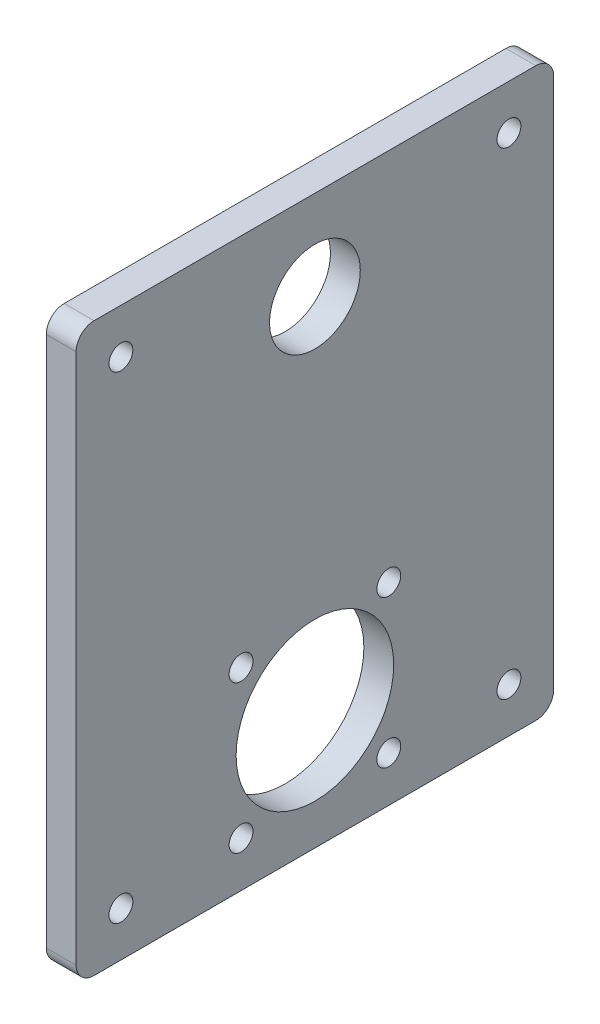
ISO-10303-21;
HEADER;
FILE_DESCRIPTION(('STEP AP214'),'2;1');
FILE_NAME('part.step','',(''),(''),'','','');
FILE_SCHEMA(('AUTOMOTIVE_DESIGN { 1 0 10303 214 1 1 1 1 }'));
ENDSEC;
DATA;
#1=APPLICATION_CONTEXT('core data for automotive mechanical design processes');
#2=APPLICATION_PROTOCOL_DEFINITION('international standard','automotive_design',2000,#1);
#3=PRODUCT_CONTEXT('',#1,'mechanical');
#4=PRODUCT('Part','Part','',(#3));
#5=PRODUCT_RELATED_PRODUCT_CATEGORY('part','',(#4));
#6=PRODUCT_DEFINITION_FORMATION('','',#4);
#7=PRODUCT_DEFINITION_CONTEXT('part definition',#1,'design');
#8=PRODUCT_DEFINITION('design','',#6,#7);
#9=PRODUCT_DEFINITION_SHAPE('','',#8);
#10=(LENGTH_UNIT() NAMED_UNIT(*) SI_UNIT(.MILLI.,.METRE.));
#11=(NAMED_UNIT(*) PLANE_ANGLE_UNIT() SI_UNIT($,.RADIAN.));
#12=(NAMED_UNIT(*) SI_UNIT($,.STERADIAN.) SOLID_ANGLE_UNIT());
#13=UNCERTAINTY_MEASURE_WITH_UNIT(LENGTH_MEASURE(1.E-05),#10,'distance_accuracy_value','');
#14=(GEOMETRIC_REPRESENTATION_CONTEXT(3) GLOBAL_UNCERTAINTY_ASSIGNED_CONTEXT((#13)) GLOBAL_UNIT_ASSIGNED_CONTEXT((#10,
#11,#12)) REPRESENTATION_CONTEXT('',''));
#15=CARTESIAN_POINT('',(0.,0.,0.));
#16=DIRECTION('',(0.,0.,1.));
#17=DIRECTION('',(1.,0.,0.));
#18=AXIS2_PLACEMENT_3D('',#15,#16,#17);
#19=CARTESIAN_POINT('',(5.,0.,0.));
#20=DIRECTION('',(-1.,0.,0.));
#21=DIRECTION('',(0.,0.,1.));
#22=AXIS2_PLACEMENT_3D('',#19,#20,#21);
#23=PLANE('',#22);
#24=DIRECTION('',(0.,-1.,0.));
#25=VECTOR('',#24,1.);
#26=CARTESIAN_POINT('',(5.,-47.5,40.));
#27=LINE('',#26,#25);
#28=CARTESIAN_POINT('',(5.,44.5,40.));
#29=VERTEX_POINT('',#28);
#30=CARTESIAN_POINT('',(5.,-44.5,40.));
#31=VERTEX_POINT('',#30);
#32=EDGE_CURVE('E185',#29,#31,#27,.T.);
#33=ORIENTED_EDGE('',*,*,#32,.T.);
#34=CARTESIAN_POINT('',(5.,-44.5,37.));
#35=DIRECTION('',(-1.,0.,0.));
#36=DIRECTION('',(0.,0.,1.));
#37=AXIS2_PLACEMENT_3D('',#34,#35,#36);
#38=CIRCLE('',#37,3.);
#39=CARTESIAN_POINT('',(5.,-47.5,37.));
#40=VERTEX_POINT('',#39);
#41=EDGE_CURVE('E158',#31,#40,#38,.F.);
#42=ORIENTED_EDGE('',*,*,#41,.T.);
#43=DIRECTION('',(0.,0.,-1.));
#44=VECTOR('',#43,1.);
#45=CARTESIAN_POINT('',(5.,-47.5,40.));
#46=LINE('',#45,#44);
#47=CARTESIAN_POINT('',(5.,-47.5,-37.));
#48=VERTEX_POINT('',#47);
#49=EDGE_CURVE('E125',#40,#48,#46,.T.);
#50=ORIENTED_EDGE('',*,*,#49,.T.);
#51=CARTESIAN_POINT('',(5.,-44.5,-37.));
#52=DIRECTION('',(-1.,0.,0.));
#53=DIRECTION('',(0.,0.,1.));
#54=AXIS2_PLACEMENT_3D('',#51,#52,#53);
#55=CIRCLE('',#54,3.);
#56=CARTESIAN_POINT('',(5.,-44.5,-40.));
#57=VERTEX_POINT('',#56);
#58=EDGE_CURVE('E155',#48,#57,#55,.F.);
#59=ORIENTED_EDGE('',*,*,#58,.T.);
#60=DIRECTION('',(0.,1.,0.));
#61=VECTOR('',#60,1.);
#62=CARTESIAN_POINT('',(5.,-47.5,-40.));
#63=LINE('',#62,#61);
#64=CARTESIAN_POINT('',(5.,44.5,-40.));
#65=VERTEX_POINT('',#64);
#66=EDGE_CURVE('E132',#57,#65,#63,.T.);
#67=ORIENTED_EDGE('',*,*,#66,.T.);
#68=CARTESIAN_POINT('',(5.,44.5,-37.));
#69=DIRECTION('',(-1.,0.,0.));
#70=DIRECTION('',(0.,0.,1.));
#71=AXIS2_PLACEMENT_3D('',#68,#69,#70);
#72=CIRCLE('',#71,3.);
#73=CARTESIAN_POINT('',(5.,47.5,-37.));
#74=VERTEX_POINT('',#73);
#75=EDGE_CURVE('E60',#65,#74,#72,.F.);
#76=ORIENTED_EDGE('',*,*,#75,.T.);
#77=DIRECTION('',(0.,0.,1.));
#78=VECTOR('',#77,1.);
#79=CARTESIAN_POINT('',(5.,47.5,40.));
#80=LINE('',#79,#78);
#81=CARTESIAN_POINT('',(5.,47.5,37.));
#82=VERTEX_POINT('',#81);
#83=EDGE_CURVE('E136',#74,#82,#80,.T.);
#84=ORIENTED_EDGE('',*,*,#83,.T.);
#85=CARTESIAN_POINT('',(5.,44.5,37.));
#86=DIRECTION('',(-1.,0.,0.));
#87=DIRECTION('',(0.,0.,1.));
#88=AXIS2_PLACEMENT_3D('',#85,#86,#87);
#89=CIRCLE('',#88,3.);
#90=EDGE_CURVE('E150',#82,#29,#89,.F.);
#91=ORIENTED_EDGE('',*,*,#90,.T.);
#92=EDGE_LOOP('',(#33,#42,#50,#59,#67,#76,#84,#91));
#93=FACE_BOUND('',#92,.T.);
#94=CARTESIAN_POINT('',(5.,-15.1256313292354,-12.3743686707646));
#95=DIRECTION('',(1.,0.,0.));
#96=DIRECTION('',(0.,0.,-1.));
#97=AXIS2_PLACEMENT_3D('',#94,#95,#96);
#98=CIRCLE('',#97,2.);
#99=CARTESIAN_POINT('',(5.,-15.1256313292354,-14.3743686707646));
#100=VERTEX_POINT('',#99);
#101=EDGE_CURVE('E175',#100,#100,#98,.T.);
#102=ORIENTED_EDGE('',*,*,#101,.F.);
#103=EDGE_LOOP('',(#102));
#104=FACE_BOUND('',#103,.T.);
#105=CARTESIAN_POINT('',(5.,-39.8743686707646,-12.3743686707646));
#106=DIRECTION('',(1.,0.,0.));
#107=DIRECTION('',(0.,0.,1.));
#108=AXIS2_PLACEMENT_3D('',#105,#106,#107);
#109=CIRCLE('',#108,1.99999999999996);
#110=CARTESIAN_POINT('',(5.,-39.8743686707646,-10.3743686707646));
#111=VERTEX_POINT('',#110);
#112=EDGE_CURVE('E463',#111,#111,#109,.T.);
#113=ORIENTED_EDGE('',*,*,#112,.F.);
#114=EDGE_LOOP('',(#113));
#115=FACE_BOUND('',#114,.T.);
#116=CARTESIAN_POINT('',(5.,-39.8743686707646,12.3743686707646));
#117=DIRECTION('',(1.,0.,0.));
#118=DIRECTION('',(0.,0.,-1.));
#119=AXIS2_PLACEMENT_3D('',#116,#117,#118);
#120=CIRCLE('',#119,1.99999999999996);
#121=CARTESIAN_POINT('',(5.,-39.8743686707646,10.3743686707646));
#122=VERTEX_POINT('',#121);
#123=EDGE_CURVE('E455',#122,#122,#120,.T.);
#124=ORIENTED_EDGE('',*,*,#123,.F.);
#125=EDGE_LOOP('',(#124));
#126=FACE_BOUND('',#125,.T.);
#127=CARTESIAN_POINT('',(5.,-15.1256313292354,12.3743686707646));
#128=DIRECTION('',(1.,0.,0.));
#129=DIRECTION('',(0.,0.,1.));
#130=AXIS2_PLACEMENT_3D('',#127,#128,#129);
#131=CIRCLE('',#130,2.);
#132=CARTESIAN_POINT('',(5.,-15.1256313292354,14.3743686707646));
#133=VERTEX_POINT('',#132);
#134=EDGE_CURVE('E447',#133,#133,#131,.T.);
#135=ORIENTED_EDGE('',*,*,#134,.F.);
#136=EDGE_LOOP('',(#135));
#137=FACE_BOUND('',#136,.T.);
#138=CARTESIAN_POINT('',(5.,32.5,0.));
#139=DIRECTION('',(1.,0.,0.));
#140=DIRECTION('',(0.,0.,-1.));
#141=AXIS2_PLACEMENT_3D('',#138,#139,#140);
#142=CIRCLE('',#141,7.60000000000001);
#143=CARTESIAN_POINT('',(5.,32.5,-7.60000000000001));
#144=VERTEX_POINT('',#143);
#145=EDGE_CURVE('E440',#144,#144,#142,.T.);
#146=ORIENTED_EDGE('',*,*,#145,.F.);
#147=EDGE_LOOP('',(#146));
#148=FACE_BOUND('',#147,.T.);
#149=CARTESIAN_POINT('',(5.,-27.5,0.));
#150=DIRECTION('',(1.,0.,0.));
#151=DIRECTION('',(0.,0.,-1.));
#152=AXIS2_PLACEMENT_3D('',#149,#150,#151);
#153=CIRCLE('',#152,13.2);
#154=CARTESIAN_POINT('',(5.,-27.5,-13.2));
#155=VERTEX_POINT('',#154);
#156=EDGE_CURVE('E429',#155,#155,#153,.T.);
#157=ORIENTED_EDGE('',*,*,#156,.F.);
#158=EDGE_LOOP('',(#157));
#159=FACE_BOUND('',#158,.T.);
#160=CARTESIAN_POINT('',(5.,40.,-32.5));
#161=DIRECTION('',(1.,0.,0.));
#162=DIRECTION('',(0.,0.,-1.));
#163=AXIS2_PLACEMENT_3D('',#160,#161,#162);
#164=CIRCLE('',#163,2.);
#165=CARTESIAN_POINT('',(5.,40.,-34.5));
#166=VERTEX_POINT('',#165);
#167=EDGE_CURVE('E421',#166,#166,#164,.T.);
#168=ORIENTED_EDGE('',*,*,#167,.F.);
#169=EDGE_LOOP('',(#168));
#170=FACE_BOUND('',#169,.T.);
#171=CARTESIAN_POINT('',(5.,-40.,-32.5));
#172=DIRECTION('',(1.,0.,0.));
#173=DIRECTION('',(0.,0.,1.));
#174=AXIS2_PLACEMENT_3D('',#171,#172,#173);
#175=CIRCLE('',#174,2.);
#176=CARTESIAN_POINT('',(5.,-40.,-30.5));
#177=VERTEX_POINT('',#176);
#178=EDGE_CURVE('E414',#177,#177,#175,.T.);
#179=ORIENTED_EDGE('',*,*,#178,.F.);
#180=EDGE_LOOP('',(#179));
#181=FACE_BOUND('',#180,.T.);
#182=CARTESIAN_POINT('',(5.,-40.,32.5));
#183=DIRECTION('',(1.,0.,0.));
#184=DIRECTION('',(0.,0.,-1.));
#185=AXIS2_PLACEMENT_3D('',#182,#183,#184);
#186=CIRCLE('',#185,2.);
#187=CARTESIAN_POINT('',(5.,-40.,30.5));
#188=VERTEX_POINT('',#187);
#189=EDGE_CURVE('E403',#188,#188,#186,.T.);
#190=ORIENTED_EDGE('',*,*,#189,.F.);
#191=EDGE_LOOP('',(#190));
#192=FACE_BOUND('',#191,.T.);
#193=CARTESIAN_POINT('',(5.,40.,32.5));
#194=DIRECTION('',(1.,0.,0.));
#195=DIRECTION('',(0.,0.,1.));
#196=AXIS2_PLACEMENT_3D('',#193,#194,#195);
#197=CIRCLE('',#196,2.);
#198=CARTESIAN_POINT('',(5.,40.,34.5));
#199=VERTEX_POINT('',#198);
#200=EDGE_CURVE('E393',#199,#199,#197,.T.);
#201=ORIENTED_EDGE('',*,*,#200,.F.);
#202=EDGE_LOOP('',(#201));
#203=FACE_BOUND('',#202,.T.);
#204=ADVANCED_FACE('F39',(#93,#104,#115,#126,#137,#148,#159,#170,#181,#192,#203),#23,.F.);
#205=CARTESIAN_POINT('',(0.,0.,0.));
#206=DIRECTION('',(-1.,0.,0.));
#207=DIRECTION('',(0.,0.,1.));
#208=AXIS2_PLACEMENT_3D('',#205,#206,#207);
#209=PLANE('',#208);
#210=CARTESIAN_POINT('',(0.,-40.,32.5));
#211=DIRECTION('',(1.,0.,0.));
#212=DIRECTION('',(0.,0.,-1.));
#213=AXIS2_PLACEMENT_3D('',#210,#211,#212);
#214=CIRCLE('',#213,2.);
#215=CARTESIAN_POINT('',(0.,-40.,30.5));
#216=VERTEX_POINT('',#215);
#217=EDGE_CURVE('E400',#216,#216,#214,.T.);
#218=ORIENTED_EDGE('',*,*,#217,.T.);
#219=EDGE_LOOP('',(#218));
#220=FACE_BOUND('',#219,.T.);
#221=CARTESIAN_POINT('',(0.,40.,-32.5));
#222=DIRECTION('',(1.,0.,0.));
#223=DIRECTION('',(0.,0.,-1.));
#224=AXIS2_PLACEMENT_3D('',#221,#222,#223);
#225=CIRCLE('',#224,2.);
#226=CARTESIAN_POINT('',(0.,40.,-34.5));
#227=VERTEX_POINT('',#226);
#228=EDGE_CURVE('E419',#227,#227,#225,.T.);
#229=ORIENTED_EDGE('',*,*,#228,.T.);
#230=EDGE_LOOP('',(#229));
#231=FACE_BOUND('',#230,.T.);
#232=CARTESIAN_POINT('',(0.,32.5,0.));
#233=DIRECTION('',(1.,0.,0.));
#234=DIRECTION('',(0.,0.,-1.));
#235=AXIS2_PLACEMENT_3D('',#232,#233,#234);
#236=CIRCLE('',#235,7.60000000000001);
#237=CARTESIAN_POINT('',(0.,32.5,-7.60000000000001));
#238=VERTEX_POINT('',#237);
#239=EDGE_CURVE('E434',#238,#238,#236,.T.);
#240=ORIENTED_EDGE('',*,*,#239,.T.);
#241=EDGE_LOOP('',(#240));
#242=FACE_BOUND('',#241,.T.);
#243=CARTESIAN_POINT('',(0.,-39.8743686707646,12.3743686707646));
#244=DIRECTION('',(1.,0.,0.));
#245=DIRECTION('',(0.,0.,-1.));
#246=AXIS2_PLACEMENT_3D('',#243,#244,#245);
#247=CIRCLE('',#246,1.99999999999996);
#248=CARTESIAN_POINT('',(0.,-39.8743686707646,10.3743686707646));
#249=VERTEX_POINT('',#248);
#250=EDGE_CURVE('E452',#249,#249,#247,.T.);
#251=ORIENTED_EDGE('',*,*,#250,.T.);
#252=EDGE_LOOP('',(#251));
#253=FACE_BOUND('',#252,.T.);
#254=CARTESIAN_POINT('',(0.,-15.1256313292354,-12.3743686707646));
#255=DIRECTION('',(1.,0.,0.));
#256=DIRECTION('',(0.,0.,-1.));
#257=AXIS2_PLACEMENT_3D('',#254,#255,#256);
#258=CIRCLE('',#257,2.);
#259=CARTESIAN_POINT('',(0.,-15.1256313292354,-14.3743686707646));
#260=VERTEX_POINT('',#259);
#261=EDGE_CURVE('E179',#260,#260,#258,.T.);
#262=ORIENTED_EDGE('',*,*,#261,.T.);
#263=EDGE_LOOP('',(#262));
#264=FACE_BOUND('',#263,.T.);
#265=DIRECTION('',(0.,0.,-1.));
#266=VECTOR('',#265,1.);
#267=CARTESIAN_POINT('',(0.,-47.5,40.));
#268=LINE('',#267,#266);
#269=CARTESIAN_POINT('',(0.,-47.5,37.));
#270=VERTEX_POINT('',#269);
#271=CARTESIAN_POINT('',(0.,-47.5,-37.));
#272=VERTEX_POINT('',#271);
#273=EDGE_CURVE('E122',#270,#272,#268,.T.);
#274=ORIENTED_EDGE('',*,*,#273,.F.);
#275=CARTESIAN_POINT('',(0.,-44.5,37.));
#276=DIRECTION('',(-1.,0.,0.));
#277=DIRECTION('',(0.,0.,1.));
#278=AXIS2_PLACEMENT_3D('',#275,#276,#277);
#279=CIRCLE('',#278,3.);
#280=CARTESIAN_POINT('',(0.,-44.5,40.));
#281=VERTEX_POINT('',#280);
#282=EDGE_CURVE('E105',#270,#281,#279,.T.);
#283=ORIENTED_EDGE('',*,*,#282,.T.);
#284=DIRECTION('',(0.,-1.,0.));
#285=VECTOR('',#284,1.);
#286=CARTESIAN_POINT('',(0.,-47.5,40.));
#287=LINE('',#286,#285);
#288=CARTESIAN_POINT('',(0.,44.5,40.));
#289=VERTEX_POINT('',#288);
#290=EDGE_CURVE('E133',#289,#281,#287,.T.);
#291=ORIENTED_EDGE('',*,*,#290,.F.);
#292=CARTESIAN_POINT('',(0.,44.5,37.));
#293=DIRECTION('',(-1.,0.,0.));
#294=DIRECTION('',(0.,0.,1.));
#295=AXIS2_PLACEMENT_3D('',#292,#293,#294);
#296=CIRCLE('',#295,3.);
#297=CARTESIAN_POINT('',(0.,47.5,37.));
#298=VERTEX_POINT('',#297);
#299=EDGE_CURVE('E126',#289,#298,#296,.T.);
#300=ORIENTED_EDGE('',*,*,#299,.T.);
#301=DIRECTION('',(0.,0.,1.));
#302=VECTOR('',#301,1.);
#303=CARTESIAN_POINT('',(0.,47.5,40.));
#304=LINE('',#303,#302);
#305=CARTESIAN_POINT('',(0.,47.5,-37.));
#306=VERTEX_POINT('',#305);
#307=EDGE_CURVE('E138',#306,#298,#304,.T.);
#308=ORIENTED_EDGE('',*,*,#307,.F.);
#309=CARTESIAN_POINT('',(0.,44.5,-37.));
#310=DIRECTION('',(-1.,0.,0.));
#311=DIRECTION('',(0.,0.,1.));
#312=AXIS2_PLACEMENT_3D('',#309,#310,#311);
#313=CIRCLE('',#312,3.);
#314=CARTESIAN_POINT('',(0.,44.5,-40.));
#315=VERTEX_POINT('',#314);
#316=EDGE_CURVE('E144',#306,#315,#313,.T.);
#317=ORIENTED_EDGE('',*,*,#316,.T.);
#318=DIRECTION('',(0.,1.,0.));
#319=VECTOR('',#318,1.);
#320=CARTESIAN_POINT('',(0.,-47.5,-40.));
#321=LINE('',#320,#319);
#322=CARTESIAN_POINT('',(0.,-44.5,-40.));
#323=VERTEX_POINT('',#322);
#324=EDGE_CURVE('E170',#323,#315,#321,.T.);
#325=ORIENTED_EDGE('',*,*,#324,.F.);
#326=CARTESIAN_POINT('',(0.,-44.5,-37.));
#327=DIRECTION('',(-1.,0.,0.));
#328=DIRECTION('',(0.,0.,1.));
#329=AXIS2_PLACEMENT_3D('',#326,#327,#328);
#330=CIRCLE('',#329,3.);
#331=EDGE_CURVE('E116',#323,#272,#330,.T.);
#332=ORIENTED_EDGE('',*,*,#331,.T.);
#333=EDGE_LOOP('',(#274,#283,#291,#300,#308,#317,#325,#332));
#334=FACE_BOUND('',#333,.T.);
#335=CARTESIAN_POINT('',(0.,-39.8743686707646,-12.3743686707646));
#336=DIRECTION('',(1.,0.,0.));
#337=DIRECTION('',(0.,0.,1.));
#338=AXIS2_PLACEMENT_3D('',#335,#336,#337);
#339=CIRCLE('',#338,1.99999999999996);
#340=CARTESIAN_POINT('',(0.,-39.8743686707646,-10.3743686707646));
#341=VERTEX_POINT('',#340);
#342=EDGE_CURVE('E460',#341,#341,#339,.T.);
#343=ORIENTED_EDGE('',*,*,#342,.T.);
#344=EDGE_LOOP('',(#343));
#345=FACE_BOUND('',#344,.T.);
#346=CARTESIAN_POINT('',(0.,-15.1256313292354,12.3743686707646));
#347=DIRECTION('',(1.,0.,0.));
#348=DIRECTION('',(0.,0.,1.));
#349=AXIS2_PLACEMENT_3D('',#346,#347,#348);
#350=CIRCLE('',#349,2.);
#351=CARTESIAN_POINT('',(0.,-15.1256313292354,14.3743686707646));
#352=VERTEX_POINT('',#351);
#353=EDGE_CURVE('E445',#352,#352,#350,.T.);
#354=ORIENTED_EDGE('',*,*,#353,.T.);
#355=EDGE_LOOP('',(#354));
#356=FACE_BOUND('',#355,.T.);
#357=CARTESIAN_POINT('',(0.,-27.5,0.));
#358=DIRECTION('',(1.,0.,0.));
#359=DIRECTION('',(0.,0.,-1.));
#360=AXIS2_PLACEMENT_3D('',#357,#358,#359);
#361=CIRCLE('',#360,13.2);
#362=CARTESIAN_POINT('',(0.,-27.5,-13.2));
#363=VERTEX_POINT('',#362);
#364=EDGE_CURVE('E426',#363,#363,#361,.T.);
#365=ORIENTED_EDGE('',*,*,#364,.T.);
#366=EDGE_LOOP('',(#365));
#367=FACE_BOUND('',#366,.T.);
#368=CARTESIAN_POINT('',(0.,-40.,-32.5));
#369=DIRECTION('',(1.,0.,0.));
#370=DIRECTION('',(0.,0.,1.));
#371=AXIS2_PLACEMENT_3D('',#368,#369,#370);
#372=CIRCLE('',#371,2.);
#373=CARTESIAN_POINT('',(0.,-40.,-30.5));
#374=VERTEX_POINT('',#373);
#375=EDGE_CURVE('E408',#374,#374,#372,.T.);
#376=ORIENTED_EDGE('',*,*,#375,.T.);
#377=EDGE_LOOP('',(#376));
#378=FACE_BOUND('',#377,.T.);
#379=CARTESIAN_POINT('',(0.,40.,32.5));
#380=DIRECTION('',(1.,0.,0.));
#381=DIRECTION('',(0.,0.,1.));
#382=AXIS2_PLACEMENT_3D('',#379,#380,#381);
#383=CIRCLE('',#382,2.);
#384=CARTESIAN_POINT('',(0.,40.,34.5));
#385=VERTEX_POINT('',#384);
#386=EDGE_CURVE('E396',#385,#385,#383,.T.);
#387=ORIENTED_EDGE('',*,*,#386,.T.);
#388=EDGE_LOOP('',(#387));
#389=FACE_BOUND('',#388,.T.);
#390=ADVANCED_FACE('F129',(#220,#231,#242,#253,#264,#334,#345,#356,#367,#378,#389),#209,.T.);
#391=CARTESIAN_POINT('',(5.,-47.5,-40.));
#392=DIRECTION('',(0.,0.,1.));
#393=DIRECTION('',(0.,-1.,0.));
#394=AXIS2_PLACEMENT_3D('',#391,#392,#393);
#395=PLANE('',#394);
#396=ORIENTED_EDGE('',*,*,#66,.F.);
#397=DIRECTION('',(-1.,0.,0.));
#398=VECTOR('',#397,1.);
#399=CARTESIAN_POINT('',(5.,-44.5,-40.));
#400=LINE('',#399,#398);
#401=EDGE_CURVE('E163',#57,#323,#400,.T.);
#402=ORIENTED_EDGE('',*,*,#401,.T.);
#403=ORIENTED_EDGE('',*,*,#324,.T.);
#404=DIRECTION('',(-1.,0.,0.));
#405=VECTOR('',#404,1.);
#406=CARTESIAN_POINT('',(5.,44.5,-40.));
#407=LINE('',#406,#405);
#408=EDGE_CURVE('E161',#315,#65,#407,.F.);
#409=ORIENTED_EDGE('',*,*,#408,.T.);
#410=EDGE_LOOP('',(#396,#402,#403,#409));
#411=FACE_BOUND('',#410,.T.);
#412=ADVANCED_FACE('F169',(#411),#395,.F.);
#413=CARTESIAN_POINT('',(5.,47.5,40.));
#414=DIRECTION('',(0.,-1.,0.));
#415=DIRECTION('',(0.,0.,-1.));
#416=AXIS2_PLACEMENT_3D('',#413,#414,#415);
#417=PLANE('',#416);
#418=ORIENTED_EDGE('',*,*,#83,.F.);
#419=DIRECTION('',(-1.,0.,0.));
#420=VECTOR('',#419,1.);
#421=CARTESIAN_POINT('',(5.,47.5,-37.));
#422=LINE('',#421,#420);
#423=EDGE_CURVE('E12',#74,#306,#422,.T.);
#424=ORIENTED_EDGE('',*,*,#423,.T.);
#425=ORIENTED_EDGE('',*,*,#307,.T.);
#426=DIRECTION('',(-1.,0.,0.));
#427=VECTOR('',#426,1.);
#428=CARTESIAN_POINT('',(5.,47.5,37.));
#429=LINE('',#428,#427);
#430=EDGE_CURVE('E47',#298,#82,#429,.F.);
#431=ORIENTED_EDGE('',*,*,#430,.T.);
#432=EDGE_LOOP('',(#418,#424,#425,#431));
#433=FACE_BOUND('',#432,.T.);
#434=ADVANCED_FACE('F206',(#433),#417,.F.);
#435=CARTESIAN_POINT('',(5.,-47.5,40.));
#436=DIRECTION('',(0.,0.,-1.));
#437=DIRECTION('',(0.,1.,0.));
#438=AXIS2_PLACEMENT_3D('',#435,#436,#437);
#439=PLANE('',#438);
#440=ORIENTED_EDGE('',*,*,#290,.T.);
#441=DIRECTION('',(-1.,0.,0.));
#442=VECTOR('',#441,1.);
#443=CARTESIAN_POINT('',(5.,-44.5,40.));
#444=LINE('',#443,#442);
#445=EDGE_CURVE('E110',#281,#31,#444,.F.);
#446=ORIENTED_EDGE('',*,*,#445,.T.);
#447=ORIENTED_EDGE('',*,*,#32,.F.);
#448=DIRECTION('',(-1.,0.,0.));
#449=VECTOR('',#448,1.);
#450=CARTESIAN_POINT('',(5.,44.5,40.));
#451=LINE('',#450,#449);
#452=EDGE_CURVE('E115',#29,#289,#451,.T.);
#453=ORIENTED_EDGE('',*,*,#452,.T.);
#454=EDGE_LOOP('',(#440,#446,#447,#453));
#455=FACE_BOUND('',#454,.T.);
#456=ADVANCED_FACE('F204',(#455),#439,.F.);
#457=CARTESIAN_POINT('',(5.,-47.5,40.));
#458=DIRECTION('',(0.,1.,0.));
#459=DIRECTION('',(0.,0.,1.));
#460=AXIS2_PLACEMENT_3D('',#457,#458,#459);
#461=PLANE('',#460);
#462=ORIENTED_EDGE('',*,*,#49,.F.);
#463=DIRECTION('',(-1.,0.,0.));
#464=VECTOR('',#463,1.);
#465=CARTESIAN_POINT('',(5.,-47.5,37.));
#466=LINE('',#465,#464);
#467=EDGE_CURVE('E109',#40,#270,#466,.T.);
#468=ORIENTED_EDGE('',*,*,#467,.T.);
#469=ORIENTED_EDGE('',*,*,#273,.T.);
#470=DIRECTION('',(-1.,0.,0.));
#471=VECTOR('',#470,1.);
#472=CARTESIAN_POINT('',(5.,-47.5,-37.));
#473=LINE('',#472,#471);
#474=EDGE_CURVE('E127',#272,#48,#473,.F.);
#475=ORIENTED_EDGE('',*,*,#474,.T.);
#476=EDGE_LOOP('',(#462,#468,#469,#475));
#477=FACE_BOUND('',#476,.T.);
#478=ADVANCED_FACE('F121',(#477),#461,.F.);
#479=CARTESIAN_POINT('',(5.,-15.1256313292354,-12.3743686707646));
#480=DIRECTION('',(-1.,0.,0.));
#481=DIRECTION('',(0.,0.,1.));
#482=AXIS2_PLACEMENT_3D('',#479,#480,#481);
#483=CYLINDRICAL_SURFACE('',#482,2.);
#484=ORIENTED_EDGE('',*,*,#101,.T.);
#485=EDGE_LOOP('',(#484));
#486=FACE_BOUND('',#485,.T.);
#487=ORIENTED_EDGE('',*,*,#261,.F.);
#488=EDGE_LOOP('',(#487));
#489=FACE_BOUND('',#488,.T.);
#490=ADVANCED_FACE('F227',(#486,#489),#483,.F.);
#491=CARTESIAN_POINT('',(5.,-39.8743686707646,-12.3743686707646));
#492=DIRECTION('',(-1.,0.,0.));
#493=DIRECTION('',(0.,0.,1.));
#494=AXIS2_PLACEMENT_3D('',#491,#492,#493);
#495=CYLINDRICAL_SURFACE('',#494,1.99999999999996);
#496=ORIENTED_EDGE('',*,*,#112,.T.);
#497=EDGE_LOOP('',(#496));
#498=FACE_BOUND('',#497,.T.);
#499=ORIENTED_EDGE('',*,*,#342,.F.);
#500=EDGE_LOOP('',(#499));
#501=FACE_BOUND('',#500,.T.);
#502=ADVANCED_FACE('F260',(#498,#501),#495,.F.);
#503=CARTESIAN_POINT('',(5.,-39.8743686707646,12.3743686707646));
#504=DIRECTION('',(-1.,0.,0.));
#505=DIRECTION('',(0.,0.,1.));
#506=AXIS2_PLACEMENT_3D('',#503,#504,#505);
#507=CYLINDRICAL_SURFACE('',#506,1.99999999999996);
#508=ORIENTED_EDGE('',*,*,#123,.T.);
#509=EDGE_LOOP('',(#508));
#510=FACE_BOUND('',#509,.T.);
#511=ORIENTED_EDGE('',*,*,#250,.F.);
#512=EDGE_LOOP('',(#511));
#513=FACE_BOUND('',#512,.T.);
#514=ADVANCED_FACE('F267',(#510,#513),#507,.F.);
#515=CARTESIAN_POINT('',(5.,-15.1256313292354,12.3743686707646));
#516=DIRECTION('',(-1.,0.,0.));
#517=DIRECTION('',(0.,0.,1.));
#518=AXIS2_PLACEMENT_3D('',#515,#516,#517);
#519=CYLINDRICAL_SURFACE('',#518,2.);
#520=ORIENTED_EDGE('',*,*,#134,.T.);
#521=EDGE_LOOP('',(#520));
#522=FACE_BOUND('',#521,.T.);
#523=ORIENTED_EDGE('',*,*,#353,.F.);
#524=EDGE_LOOP('',(#523));
#525=FACE_BOUND('',#524,.T.);
#526=ADVANCED_FACE('F274',(#522,#525),#519,.F.);
#527=CARTESIAN_POINT('',(5.,32.5,0.));
#528=DIRECTION('',(-1.,0.,0.));
#529=DIRECTION('',(0.,0.,1.));
#530=AXIS2_PLACEMENT_3D('',#527,#528,#529);
#531=CYLINDRICAL_SURFACE('',#530,7.60000000000001);
#532=ORIENTED_EDGE('',*,*,#145,.T.);
#533=EDGE_LOOP('',(#532));
#534=FACE_BOUND('',#533,.T.);
#535=ORIENTED_EDGE('',*,*,#239,.F.);
#536=EDGE_LOOP('',(#535));
#537=FACE_BOUND('',#536,.T.);
#538=ADVANCED_FACE('F282',(#534,#537),#531,.F.);
#539=CARTESIAN_POINT('',(5.,-27.5,0.));
#540=DIRECTION('',(-1.,0.,0.));
#541=DIRECTION('',(0.,0.,1.));
#542=AXIS2_PLACEMENT_3D('',#539,#540,#541);
#543=CYLINDRICAL_SURFACE('',#542,13.2);
#544=ORIENTED_EDGE('',*,*,#156,.T.);
#545=EDGE_LOOP('',(#544));
#546=FACE_BOUND('',#545,.T.);
#547=ORIENTED_EDGE('',*,*,#364,.F.);
#548=EDGE_LOOP('',(#547));
#549=FACE_BOUND('',#548,.T.);
#550=ADVANCED_FACE('F290',(#546,#549),#543,.F.);
#551=CARTESIAN_POINT('',(5.,40.,-32.5));
#552=DIRECTION('',(-1.,0.,0.));
#553=DIRECTION('',(0.,0.,1.));
#554=AXIS2_PLACEMENT_3D('',#551,#552,#553);
#555=CYLINDRICAL_SURFACE('',#554,2.);
#556=ORIENTED_EDGE('',*,*,#167,.T.);
#557=EDGE_LOOP('',(#556));
#558=FACE_BOUND('',#557,.T.);
#559=ORIENTED_EDGE('',*,*,#228,.F.);
#560=EDGE_LOOP('',(#559));
#561=FACE_BOUND('',#560,.T.);
#562=ADVANCED_FACE('F298',(#558,#561),#555,.F.);
#563=CARTESIAN_POINT('',(5.,-40.,-32.5));
#564=DIRECTION('',(-1.,0.,0.));
#565=DIRECTION('',(0.,0.,1.));
#566=AXIS2_PLACEMENT_3D('',#563,#564,#565);
#567=CYLINDRICAL_SURFACE('',#566,2.);
#568=ORIENTED_EDGE('',*,*,#178,.T.);
#569=EDGE_LOOP('',(#568));
#570=FACE_BOUND('',#569,.T.);
#571=ORIENTED_EDGE('',*,*,#375,.F.);
#572=EDGE_LOOP('',(#571));
#573=FACE_BOUND('',#572,.T.);
#574=ADVANCED_FACE('F306',(#570,#573),#567,.F.);
#575=CARTESIAN_POINT('',(5.,-40.,32.5));
#576=DIRECTION('',(-1.,0.,0.));
#577=DIRECTION('',(0.,0.,1.));
#578=AXIS2_PLACEMENT_3D('',#575,#576,#577);
#579=CYLINDRICAL_SURFACE('',#578,2.);
#580=ORIENTED_EDGE('',*,*,#189,.T.);
#581=EDGE_LOOP('',(#580));
#582=FACE_BOUND('',#581,.T.);
#583=ORIENTED_EDGE('',*,*,#217,.F.);
#584=EDGE_LOOP('',(#583));
#585=FACE_BOUND('',#584,.T.);
#586=ADVANCED_FACE('F314',(#582,#585),#579,.F.);
#587=CARTESIAN_POINT('',(5.,40.,32.5));
#588=DIRECTION('',(-1.,0.,0.));
#589=DIRECTION('',(0.,0.,1.));
#590=AXIS2_PLACEMENT_3D('',#587,#588,#589);
#591=CYLINDRICAL_SURFACE('',#590,2.);
#592=ORIENTED_EDGE('',*,*,#200,.T.);
#593=EDGE_LOOP('',(#592));
#594=FACE_BOUND('',#593,.T.);
#595=ORIENTED_EDGE('',*,*,#386,.F.);
#596=EDGE_LOOP('',(#595));
#597=FACE_BOUND('',#596,.T.);
#598=ADVANCED_FACE('F217',(#594,#597),#591,.F.);
#599=CARTESIAN_POINT('',(5.,-44.5,37.));
#600=DIRECTION('',(-1.,0.,0.));
#601=DIRECTION('',(0.,0.,1.));
#602=AXIS2_PLACEMENT_3D('',#599,#600,#601);
#603=CYLINDRICAL_SURFACE('',#602,3.);
#604=ORIENTED_EDGE('',*,*,#41,.F.);
#605=ORIENTED_EDGE('',*,*,#445,.F.);
#606=ORIENTED_EDGE('',*,*,#282,.F.);
#607=ORIENTED_EDGE('',*,*,#467,.F.);
#608=EDGE_LOOP('',(#604,#605,#606,#607));
#609=FACE_BOUND('',#608,.T.);
#610=ADVANCED_FACE('F108',(#609),#603,.T.);
#611=CARTESIAN_POINT('',(5.,-44.5,-37.));
#612=DIRECTION('',(-1.,0.,0.));
#613=DIRECTION('',(0.,0.,1.));
#614=AXIS2_PLACEMENT_3D('',#611,#612,#613);
#615=CYLINDRICAL_SURFACE('',#614,3.);
#616=ORIENTED_EDGE('',*,*,#58,.F.);
#617=ORIENTED_EDGE('',*,*,#474,.F.);
#618=ORIENTED_EDGE('',*,*,#331,.F.);
#619=ORIENTED_EDGE('',*,*,#401,.F.);
#620=EDGE_LOOP('',(#616,#617,#618,#619));
#621=FACE_BOUND('',#620,.T.);
#622=ADVANCED_FACE('F210',(#621),#615,.T.);
#623=CARTESIAN_POINT('',(5.,44.5,-37.));
#624=DIRECTION('',(-1.,0.,0.));
#625=DIRECTION('',(0.,0.,1.));
#626=AXIS2_PLACEMENT_3D('',#623,#624,#625);
#627=CYLINDRICAL_SURFACE('',#626,3.);
#628=ORIENTED_EDGE('',*,*,#75,.F.);
#629=ORIENTED_EDGE('',*,*,#408,.F.);
#630=ORIENTED_EDGE('',*,*,#316,.F.);
#631=ORIENTED_EDGE('',*,*,#423,.F.);
#632=EDGE_LOOP('',(#628,#629,#630,#631));
#633=FACE_BOUND('',#632,.T.);
#634=ADVANCED_FACE('F209',(#633),#627,.T.);
#635=CARTESIAN_POINT('',(5.,44.5,37.));
#636=DIRECTION('',(-1.,0.,0.));
#637=DIRECTION('',(0.,0.,1.));
#638=AXIS2_PLACEMENT_3D('',#635,#636,#637);
#639=CYLINDRICAL_SURFACE('',#638,3.);
#640=ORIENTED_EDGE('',*,*,#90,.F.);
#641=ORIENTED_EDGE('',*,*,#430,.F.);
#642=ORIENTED_EDGE('',*,*,#299,.F.);
#643=ORIENTED_EDGE('',*,*,#452,.F.);
#644=EDGE_LOOP('',(#640,#641,#642,#643));
#645=FACE_BOUND('',#644,.T.);
#646=ADVANCED_FACE('F41',(#645),#639,.T.);
#647=CLOSED_SHELL('',(#204,#390,#412,#434,#456,#478,#490,#502,#514,#526,#538,#550,#562,#574,
#586,#598,#610,#622,#634,#646));
#648=MANIFOLD_SOLID_BREP('B2',#647);
#649=ADVANCED_BREP_SHAPE_REPRESENTATION('',(#18,#648),#14);
#650=SHAPE_DEFINITION_REPRESENTATION(#9,#649);
ENDSEC;
END-ISO-10303-21;
